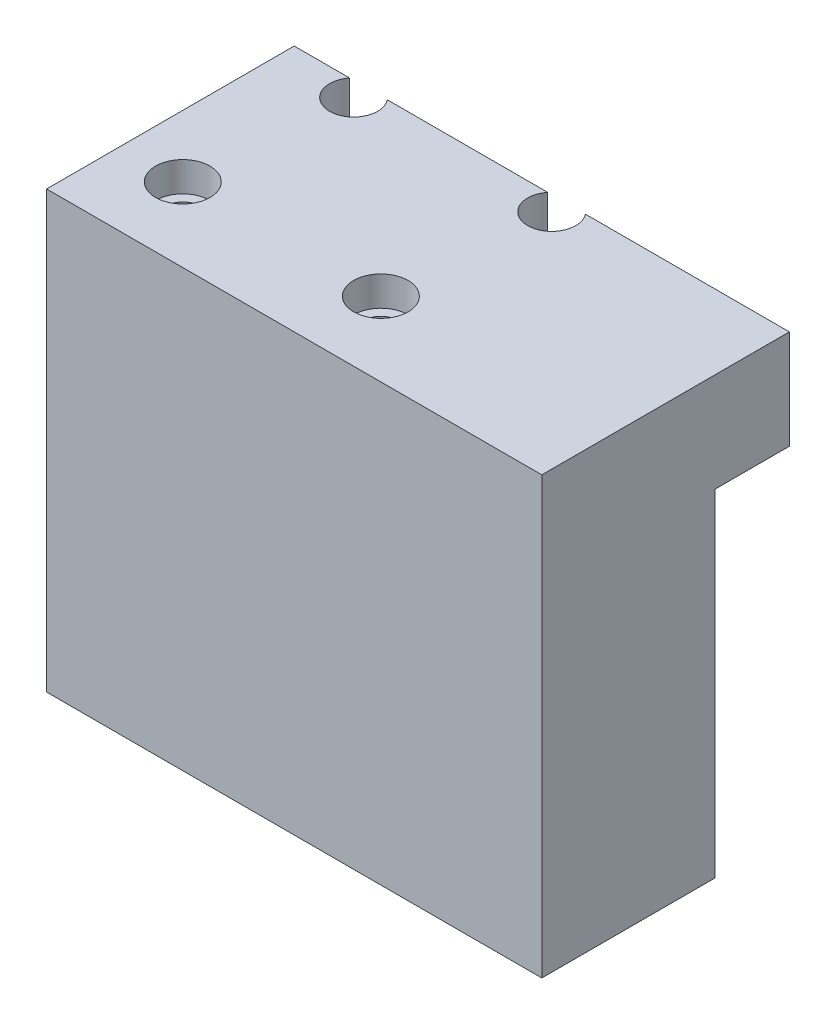
ISO-10303-21;
HEADER;
FILE_DESCRIPTION(('STEP AP214'),'2;1');
FILE_NAME('part.step','',(''),(''),'','','');
FILE_SCHEMA(('AUTOMOTIVE_DESIGN { 1 0 10303 214 1 1 1 1 }'));
ENDSEC;
DATA;
#1=APPLICATION_CONTEXT('core data for automotive mechanical design processes');
#2=APPLICATION_PROTOCOL_DEFINITION('international standard','automotive_design',2000,#1);
#3=PRODUCT_CONTEXT('',#1,'mechanical');
#4=PRODUCT('Part','Part','',(#3));
#5=PRODUCT_RELATED_PRODUCT_CATEGORY('part','',(#4));
#6=PRODUCT_DEFINITION_FORMATION('','',#4);
#7=PRODUCT_DEFINITION_CONTEXT('part definition',#1,'design');
#8=PRODUCT_DEFINITION('design','',#6,#7);
#9=PRODUCT_DEFINITION_SHAPE('','',#8);
#10=(LENGTH_UNIT() NAMED_UNIT(*) SI_UNIT(.MILLI.,.METRE.));
#11=(NAMED_UNIT(*) PLANE_ANGLE_UNIT() SI_UNIT($,.RADIAN.));
#12=(NAMED_UNIT(*) SI_UNIT($,.STERADIAN.) SOLID_ANGLE_UNIT());
#13=UNCERTAINTY_MEASURE_WITH_UNIT(LENGTH_MEASURE(1.E-05),#10,'distance_accuracy_value','');
#14=(GEOMETRIC_REPRESENTATION_CONTEXT(3) GLOBAL_UNCERTAINTY_ASSIGNED_CONTEXT((#13)) GLOBAL_UNIT_ASSIGNED_CONTEXT((#10,
#11,#12)) REPRESENTATION_CONTEXT('',''));
#15=CARTESIAN_POINT('',(0.,0.,0.));
#16=DIRECTION('',(0.,0.,1.));
#17=DIRECTION('',(1.,0.,0.));
#18=AXIS2_PLACEMENT_3D('',#15,#16,#17);
#19=CARTESIAN_POINT('',(0.,88.,0.));
#20=DIRECTION('',(0.,0.,-1.));
#21=DIRECTION('',(-1.,0.,0.));
#22=AXIS2_PLACEMENT_3D('',#19,#20,#21);
#23=PLANE('',#22);
#24=DIRECTION('',(0.,1.,0.));
#25=VECTOR('',#24,1.);
#26=CARTESIAN_POINT('',(51.1891601975418,0.,0.));
#27=LINE('',#26,#25);
#28=CARTESIAN_POINT('',(51.1891601975418,68.,0.));
#29=VERTEX_POINT('',#28);
#30=CARTESIAN_POINT('',(51.1891601975418,88.,0.));
#31=VERTEX_POINT('',#30);
#32=EDGE_CURVE('E113',#29,#31,#27,.T.);
#33=ORIENTED_EDGE('',*,*,#32,.F.);
#34=DIRECTION('',(-1.,0.,0.));
#35=VECTOR('',#34,1.);
#36=CARTESIAN_POINT('',(100.,68.,0.));
#37=LINE('',#36,#35);
#38=CARTESIAN_POINT('',(18.8108398024582,68.,0.));
#39=VERTEX_POINT('',#38);
#40=EDGE_CURVE('E57',#29,#39,#37,.T.);
#41=ORIENTED_EDGE('',*,*,#40,.T.);
#42=DIRECTION('',(0.,1.,0.));
#43=VECTOR('',#42,1.);
#44=CARTESIAN_POINT('',(18.8108398024582,0.,0.));
#45=LINE('',#44,#43);
#46=CARTESIAN_POINT('',(18.8108398024582,88.,0.));
#47=VERTEX_POINT('',#46);
#48=EDGE_CURVE('E177',#47,#39,#45,.F.);
#49=ORIENTED_EDGE('',*,*,#48,.F.);
#50=DIRECTION('',(-1.,0.,0.));
#51=VECTOR('',#50,1.);
#52=CARTESIAN_POINT('',(0.,88.,0.));
#53=LINE('',#52,#51);
#54=EDGE_CURVE('E133',#31,#47,#53,.T.);
#55=ORIENTED_EDGE('',*,*,#54,.F.);
#56=EDGE_LOOP('',(#33,#41,#49,#55));
#57=FACE_BOUND('',#56,.T.);
#58=ADVANCED_FACE('F35',(#57),#23,.T.);
#59=DIRECTION('',(0.,1.,0.));
#60=VECTOR('',#59,1.);
#61=CARTESIAN_POINT('',(11.1891601975418,0.,0.));
#62=LINE('',#61,#60);
#63=CARTESIAN_POINT('',(11.1891601975418,68.,0.));
#64=VERTEX_POINT('',#63);
#65=CARTESIAN_POINT('',(11.1891601975418,88.,0.));
#66=VERTEX_POINT('',#65);
#67=EDGE_CURVE('E172',#64,#66,#62,.T.);
#68=ORIENTED_EDGE('',*,*,#67,.F.);
#69=CARTESIAN_POINT('',(0.,68.,0.));
#70=VERTEX_POINT('',#69);
#71=EDGE_CURVE('E163',#64,#70,#37,.T.);
#72=ORIENTED_EDGE('',*,*,#71,.T.);
#73=DIRECTION('',(0.,-1.,0.));
#74=VECTOR('',#73,1.);
#75=CARTESIAN_POINT('',(0.,0.,0.));
#76=LINE('',#75,#74);
#77=CARTESIAN_POINT('',(0.,88.,0.));
#78=VERTEX_POINT('',#77);
#79=EDGE_CURVE('E146',#78,#70,#76,.T.);
#80=ORIENTED_EDGE('',*,*,#79,.F.);
#81=EDGE_CURVE('E135',#66,#78,#53,.T.);
#82=ORIENTED_EDGE('',*,*,#81,.F.);
#83=EDGE_LOOP('',(#68,#72,#80,#82));
#84=FACE_BOUND('',#83,.T.);
#85=ADVANCED_FACE('F234',(#84),#23,.T.);
#86=CARTESIAN_POINT('',(0.,0.,50.));
#87=DIRECTION('',(1.,0.,0.));
#88=DIRECTION('',(0.,0.,-1.));
#89=AXIS2_PLACEMENT_3D('',#86,#87,#88);
#90=PLANE('',#89);
#91=ORIENTED_EDGE('',*,*,#79,.T.);
#92=DIRECTION('',(0.,0.,-1.));
#93=VECTOR('',#92,1.);
#94=CARTESIAN_POINT('',(0.,68.,0.));
#95=LINE('',#94,#93);
#96=CARTESIAN_POINT('',(0.,68.,15.));
#97=VERTEX_POINT('',#96);
#98=EDGE_CURVE('E165',#97,#70,#95,.T.);
#99=ORIENTED_EDGE('',*,*,#98,.F.);
#100=DIRECTION('',(0.,1.,0.));
#101=VECTOR('',#100,1.);
#102=CARTESIAN_POINT('',(0.,0.,15.));
#103=LINE('',#102,#101);
#104=CARTESIAN_POINT('',(0.,0.,15.));
#105=VERTEX_POINT('',#104);
#106=EDGE_CURVE('E169',#105,#97,#103,.T.);
#107=ORIENTED_EDGE('',*,*,#106,.F.);
#108=DIRECTION('',(0.,0.,-1.));
#109=VECTOR('',#108,1.);
#110=CARTESIAN_POINT('',(0.,0.,50.));
#111=LINE('',#110,#109);
#112=CARTESIAN_POINT('',(0.,0.,50.));
#113=VERTEX_POINT('',#112);
#114=EDGE_CURVE('E279',#113,#105,#111,.T.);
#115=ORIENTED_EDGE('',*,*,#114,.F.);
#116=DIRECTION('',(0.,-1.,0.));
#117=VECTOR('',#116,1.);
#118=CARTESIAN_POINT('',(0.,0.,50.));
#119=LINE('',#118,#117);
#120=CARTESIAN_POINT('',(0.,88.,50.));
#121=VERTEX_POINT('',#120);
#122=EDGE_CURVE('E132',#121,#113,#119,.T.);
#123=ORIENTED_EDGE('',*,*,#122,.F.);
#124=DIRECTION('',(0.,0.,-1.));
#125=VECTOR('',#124,1.);
#126=CARTESIAN_POINT('',(0.,88.,50.));
#127=LINE('',#126,#125);
#128=EDGE_CURVE('E154',#121,#78,#127,.T.);
#129=ORIENTED_EDGE('',*,*,#128,.T.);
#130=EDGE_LOOP('',(#91,#99,#107,#115,#123,#129));
#131=FACE_BOUND('',#130,.T.);
#132=ADVANCED_FACE('F37',(#131),#90,.F.);
#133=CARTESIAN_POINT('',(0.,0.,50.));
#134=DIRECTION('',(0.,1.,0.));
#135=DIRECTION('',(0.,0.,1.));
#136=AXIS2_PLACEMENT_3D('',#133,#134,#135);
#137=PLANE('',#136);
#138=CARTESIAN_POINT('',(12.5,0.,35.));
#139=DIRECTION('',(0.,1.,0.));
#140=DIRECTION('',(0.,0.,1.));
#141=AXIS2_PLACEMENT_3D('',#138,#139,#140);
#142=CIRCLE('',#141,3.49999999999998);
#143=CARTESIAN_POINT('',(12.5,0.,38.5));
#144=VERTEX_POINT('',#143);
#145=EDGE_CURVE('E194',#144,#144,#142,.T.);
#146=ORIENTED_EDGE('',*,*,#145,.T.);
#147=EDGE_LOOP('',(#146));
#148=FACE_BOUND('',#147,.T.);
#149=CARTESIAN_POINT('',(52.5,0.,35.));
#150=DIRECTION('',(0.,1.,0.));
#151=DIRECTION('',(0.,0.,1.));
#152=AXIS2_PLACEMENT_3D('',#149,#150,#151);
#153=CIRCLE('',#152,3.49999999999998);
#154=CARTESIAN_POINT('',(52.5,0.,38.5));
#155=VERTEX_POINT('',#154);
#156=EDGE_CURVE('E117',#155,#155,#153,.T.);
#157=ORIENTED_EDGE('',*,*,#156,.T.);
#158=EDGE_LOOP('',(#157));
#159=FACE_BOUND('',#158,.T.);
#160=ORIENTED_EDGE('',*,*,#114,.T.);
#161=DIRECTION('',(-1.,0.,0.));
#162=VECTOR('',#161,1.);
#163=CARTESIAN_POINT('',(100.,0.,15.));
#164=LINE('',#163,#162);
#165=CARTESIAN_POINT('',(100.,0.,15.));
#166=VERTEX_POINT('',#165);
#167=EDGE_CURVE('E158',#166,#105,#164,.T.);
#168=ORIENTED_EDGE('',*,*,#167,.F.);
#169=DIRECTION('',(0.,0.,-1.));
#170=VECTOR('',#169,1.);
#171=CARTESIAN_POINT('',(100.,0.,50.));
#172=LINE('',#171,#170);
#173=CARTESIAN_POINT('',(100.,0.,50.));
#174=VERTEX_POINT('',#173);
#175=EDGE_CURVE('E285',#174,#166,#172,.T.);
#176=ORIENTED_EDGE('',*,*,#175,.F.);
#177=DIRECTION('',(1.,0.,0.));
#178=VECTOR('',#177,1.);
#179=CARTESIAN_POINT('',(0.,0.,50.));
#180=LINE('',#179,#178);
#181=EDGE_CURVE('E137',#113,#174,#180,.T.);
#182=ORIENTED_EDGE('',*,*,#181,.F.);
#183=EDGE_LOOP('',(#160,#168,#176,#182));
#184=FACE_BOUND('',#183,.T.);
#185=ADVANCED_FACE('F272',(#148,#159,#184),#137,.F.);
#186=CARTESIAN_POINT('',(100.,0.,50.));
#187=DIRECTION('',(-1.,0.,0.));
#188=DIRECTION('',(0.,0.,1.));
#189=AXIS2_PLACEMENT_3D('',#186,#187,#188);
#190=PLANE('',#189);
#191=DIRECTION('',(0.,1.,0.));
#192=VECTOR('',#191,1.);
#193=CARTESIAN_POINT('',(100.,0.,15.));
#194=LINE('',#193,#192);
#195=CARTESIAN_POINT('',(100.,68.,15.));
#196=VERTEX_POINT('',#195);
#197=EDGE_CURVE('E168',#166,#196,#194,.T.);
#198=ORIENTED_EDGE('',*,*,#197,.T.);
#199=DIRECTION('',(0.,0.,-1.));
#200=VECTOR('',#199,1.);
#201=CARTESIAN_POINT('',(100.,68.,0.));
#202=LINE('',#201,#200);
#203=CARTESIAN_POINT('',(100.,68.,0.));
#204=VERTEX_POINT('',#203);
#205=EDGE_CURVE('E161',#196,#204,#202,.T.);
#206=ORIENTED_EDGE('',*,*,#205,.T.);
#207=DIRECTION('',(0.,1.,0.));
#208=VECTOR('',#207,1.);
#209=CARTESIAN_POINT('',(100.,0.,0.));
#210=LINE('',#209,#208);
#211=CARTESIAN_POINT('',(100.,88.,0.));
#212=VERTEX_POINT('',#211);
#213=EDGE_CURVE('E141',#204,#212,#210,.T.);
#214=ORIENTED_EDGE('',*,*,#213,.T.);
#215=DIRECTION('',(0.,0.,-1.));
#216=VECTOR('',#215,1.);
#217=CARTESIAN_POINT('',(100.,88.,50.));
#218=LINE('',#217,#216);
#219=CARTESIAN_POINT('',(100.,88.,50.));
#220=VERTEX_POINT('',#219);
#221=EDGE_CURVE('E131',#220,#212,#218,.T.);
#222=ORIENTED_EDGE('',*,*,#221,.F.);
#223=DIRECTION('',(0.,1.,0.));
#224=VECTOR('',#223,1.);
#225=CARTESIAN_POINT('',(100.,0.,50.));
#226=LINE('',#225,#224);
#227=EDGE_CURVE('E155',#174,#220,#226,.T.);
#228=ORIENTED_EDGE('',*,*,#227,.F.);
#229=ORIENTED_EDGE('',*,*,#175,.T.);
#230=EDGE_LOOP('',(#198,#206,#214,#222,#228,#229));
#231=FACE_BOUND('',#230,.T.);
#232=ADVANCED_FACE('F212',(#231),#190,.F.);
#233=CARTESIAN_POINT('',(0.,88.,50.));
#234=DIRECTION('',(0.,-1.,0.));
#235=DIRECTION('',(0.,0.,-1.));
#236=AXIS2_PLACEMENT_3D('',#233,#234,#235);
#237=PLANE('',#236);
#238=CARTESIAN_POINT('',(12.5,88.,35.));
#239=DIRECTION('',(0.,1.,0.));
#240=DIRECTION('',(0.,0.,1.));
#241=AXIS2_PLACEMENT_3D('',#238,#239,#240);
#242=CIRCLE('',#241,5.5);
#243=CARTESIAN_POINT('',(12.5,88.,40.5));
#244=VERTEX_POINT('',#243);
#245=EDGE_CURVE('E203',#244,#244,#242,.T.);
#246=ORIENTED_EDGE('',*,*,#245,.F.);
#247=EDGE_LOOP('',(#246));
#248=FACE_BOUND('',#247,.T.);
#249=CARTESIAN_POINT('',(52.5,88.,35.));
#250=DIRECTION('',(0.,1.,0.));
#251=DIRECTION('',(0.,0.,1.));
#252=AXIS2_PLACEMENT_3D('',#249,#250,#251);
#253=CIRCLE('',#252,5.5);
#254=CARTESIAN_POINT('',(52.5,88.,40.5));
#255=VERTEX_POINT('',#254);
#256=EDGE_CURVE('E191',#255,#255,#253,.T.);
#257=ORIENTED_EDGE('',*,*,#256,.F.);
#258=EDGE_LOOP('',(#257));
#259=FACE_BOUND('',#258,.T.);
#260=CARTESIAN_POINT('',(58.8108398024582,88.,0.));
#261=VERTEX_POINT('',#260);
#262=EDGE_CURVE('E124',#212,#261,#53,.T.);
#263=ORIENTED_EDGE('',*,*,#262,.T.);
#264=CARTESIAN_POINT('',(55.,88.,3.));
#265=DIRECTION('',(0.,1.,0.));
#266=DIRECTION('',(0.,0.,1.));
#267=AXIS2_PLACEMENT_3D('',#264,#265,#266);
#268=CIRCLE('',#267,4.85);
#269=EDGE_CURVE('E111',#31,#261,#268,.T.);
#270=ORIENTED_EDGE('',*,*,#269,.F.);
#271=ORIENTED_EDGE('',*,*,#54,.T.);
#272=CARTESIAN_POINT('',(15.,88.,3.));
#273=DIRECTION('',(0.,1.,0.));
#274=DIRECTION('',(0.,0.,1.));
#275=AXIS2_PLACEMENT_3D('',#272,#273,#274);
#276=CIRCLE('',#275,4.85);
#277=EDGE_CURVE('E179',#66,#47,#276,.T.);
#278=ORIENTED_EDGE('',*,*,#277,.F.);
#279=ORIENTED_EDGE('',*,*,#81,.T.);
#280=ORIENTED_EDGE('',*,*,#128,.F.);
#281=DIRECTION('',(-1.,0.,0.));
#282=VECTOR('',#281,1.);
#283=CARTESIAN_POINT('',(0.,88.,50.));
#284=LINE('',#283,#282);
#285=EDGE_CURVE('E152',#220,#121,#284,.T.);
#286=ORIENTED_EDGE('',*,*,#285,.F.);
#287=ORIENTED_EDGE('',*,*,#221,.T.);
#288=EDGE_LOOP('',(#263,#270,#271,#278,#279,#280,#286,#287));
#289=FACE_BOUND('',#288,.T.);
#290=ADVANCED_FACE('F128',(#248,#259,#289),#237,.F.);
#291=CARTESIAN_POINT('',(0.,88.,50.));
#292=DIRECTION('',(0.,0.,-1.));
#293=DIRECTION('',(-1.,0.,0.));
#294=AXIS2_PLACEMENT_3D('',#291,#292,#293);
#295=PLANE('',#294);
#296=ORIENTED_EDGE('',*,*,#122,.T.);
#297=ORIENTED_EDGE('',*,*,#181,.T.);
#298=ORIENTED_EDGE('',*,*,#227,.T.);
#299=ORIENTED_EDGE('',*,*,#285,.T.);
#300=EDGE_LOOP('',(#296,#297,#298,#299));
#301=FACE_BOUND('',#300,.T.);
#302=ADVANCED_FACE('F211',(#301),#295,.F.);
#303=DIRECTION('',(0.,1.,0.));
#304=VECTOR('',#303,1.);
#305=CARTESIAN_POINT('',(58.8108398024582,0.,0.));
#306=LINE('',#305,#304);
#307=CARTESIAN_POINT('',(58.8108398024582,68.,0.));
#308=VERTEX_POINT('',#307);
#309=EDGE_CURVE('E50',#261,#308,#306,.F.);
#310=ORIENTED_EDGE('',*,*,#309,.F.);
#311=ORIENTED_EDGE('',*,*,#262,.F.);
#312=ORIENTED_EDGE('',*,*,#213,.F.);
#313=EDGE_CURVE('E125',#204,#308,#37,.T.);
#314=ORIENTED_EDGE('',*,*,#313,.T.);
#315=EDGE_LOOP('',(#310,#311,#312,#314));
#316=FACE_BOUND('',#315,.T.);
#317=ADVANCED_FACE('F122',(#316),#23,.T.);
#318=CARTESIAN_POINT('',(100.,68.,0.));
#319=DIRECTION('',(0.,1.,0.));
#320=DIRECTION('',(0.,0.,1.));
#321=AXIS2_PLACEMENT_3D('',#318,#319,#320);
#322=PLANE('',#321);
#323=ORIENTED_EDGE('',*,*,#40,.F.);
#324=CARTESIAN_POINT('',(55.,68.,3.));
#325=DIRECTION('',(0.,1.,0.));
#326=DIRECTION('',(0.,0.,1.));
#327=AXIS2_PLACEMENT_3D('',#324,#325,#326);
#328=CIRCLE('',#327,4.85);
#329=EDGE_CURVE('E11',#29,#308,#328,.T.);
#330=ORIENTED_EDGE('',*,*,#329,.T.);
#331=ORIENTED_EDGE('',*,*,#313,.F.);
#332=ORIENTED_EDGE('',*,*,#205,.F.);
#333=DIRECTION('',(-1.,0.,0.));
#334=VECTOR('',#333,1.);
#335=CARTESIAN_POINT('',(100.,68.,15.));
#336=LINE('',#335,#334);
#337=EDGE_CURVE('E160',#196,#97,#336,.T.);
#338=ORIENTED_EDGE('',*,*,#337,.T.);
#339=ORIENTED_EDGE('',*,*,#98,.T.);
#340=ORIENTED_EDGE('',*,*,#71,.F.);
#341=CARTESIAN_POINT('',(15.,68.,3.));
#342=DIRECTION('',(0.,1.,0.));
#343=DIRECTION('',(0.,0.,1.));
#344=AXIS2_PLACEMENT_3D('',#341,#342,#343);
#345=CIRCLE('',#344,4.85);
#346=EDGE_CURVE('E43',#64,#39,#345,.T.);
#347=ORIENTED_EDGE('',*,*,#346,.T.);
#348=EDGE_LOOP('',(#323,#330,#331,#332,#338,#339,#340,#347));
#349=FACE_BOUND('',#348,.T.);
#350=ADVANCED_FACE('F242',(#349),#322,.F.);
#351=CARTESIAN_POINT('',(100.,0.,15.));
#352=DIRECTION('',(0.,0.,1.));
#353=DIRECTION('',(1.,0.,0.));
#354=AXIS2_PLACEMENT_3D('',#351,#352,#353);
#355=PLANE('',#354);
#356=ORIENTED_EDGE('',*,*,#106,.T.);
#357=ORIENTED_EDGE('',*,*,#337,.F.);
#358=ORIENTED_EDGE('',*,*,#197,.F.);
#359=ORIENTED_EDGE('',*,*,#167,.T.);
#360=EDGE_LOOP('',(#356,#357,#358,#359));
#361=FACE_BOUND('',#360,.T.);
#362=ADVANCED_FACE('F247',(#361),#355,.F.);
#363=CARTESIAN_POINT('',(15.,0.,3.));
#364=DIRECTION('',(0.,1.,0.));
#365=DIRECTION('',(0.,0.,1.));
#366=AXIS2_PLACEMENT_3D('',#363,#364,#365);
#367=CYLINDRICAL_SURFACE('',#366,4.85);
#368=ORIENTED_EDGE('',*,*,#67,.T.);
#369=ORIENTED_EDGE('',*,*,#277,.T.);
#370=ORIENTED_EDGE('',*,*,#48,.T.);
#371=ORIENTED_EDGE('',*,*,#346,.F.);
#372=EDGE_LOOP('',(#368,#369,#370,#371));
#373=FACE_BOUND('',#372,.T.);
#374=ADVANCED_FACE('F255',(#373),#367,.F.);
#375=CARTESIAN_POINT('',(55.,0.,3.));
#376=DIRECTION('',(0.,1.,0.));
#377=DIRECTION('',(0.,0.,1.));
#378=AXIS2_PLACEMENT_3D('',#375,#376,#377);
#379=CYLINDRICAL_SURFACE('',#378,4.85);
#380=ORIENTED_EDGE('',*,*,#32,.T.);
#381=ORIENTED_EDGE('',*,*,#269,.T.);
#382=ORIENTED_EDGE('',*,*,#309,.T.);
#383=ORIENTED_EDGE('',*,*,#329,.F.);
#384=EDGE_LOOP('',(#380,#381,#382,#383));
#385=FACE_BOUND('',#384,.T.);
#386=ADVANCED_FACE('F112',(#385),#379,.F.);
#387=CARTESIAN_POINT('',(52.5,88.,35.));
#388=DIRECTION('',(0.,1.,0.));
#389=DIRECTION('',(0.,0.,1.));
#390=AXIS2_PLACEMENT_3D('',#387,#388,#389);
#391=CYLINDRICAL_SURFACE('',#390,3.5);
#392=ORIENTED_EDGE('',*,*,#156,.F.);
#393=EDGE_LOOP('',(#392));
#394=FACE_BOUND('',#393,.T.);
#395=CARTESIAN_POINT('',(52.5,82.,35.));
#396=DIRECTION('',(0.,1.,0.));
#397=DIRECTION('',(0.,0.,1.));
#398=AXIS2_PLACEMENT_3D('',#395,#396,#397);
#399=CIRCLE('',#398,3.50000000000001);
#400=CARTESIAN_POINT('',(52.5,82.,38.5));
#401=VERTEX_POINT('',#400);
#402=EDGE_CURVE('E185',#401,#401,#399,.T.);
#403=ORIENTED_EDGE('',*,*,#402,.T.);
#404=EDGE_LOOP('',(#403));
#405=FACE_BOUND('',#404,.T.);
#406=ADVANCED_FACE('F229',(#394,#405),#391,.F.);
#407=CARTESIAN_POINT('',(56.,82.,35.));
#408=DIRECTION('',(0.,-1.,0.));
#409=DIRECTION('',(0.,0.,-1.));
#410=AXIS2_PLACEMENT_3D('',#407,#408,#409);
#411=PLANE('',#410);
#412=ORIENTED_EDGE('',*,*,#402,.F.);
#413=EDGE_LOOP('',(#412));
#414=FACE_BOUND('',#413,.T.);
#415=CARTESIAN_POINT('',(52.5,82.,35.));
#416=DIRECTION('',(0.,1.,0.));
#417=DIRECTION('',(0.,0.,1.));
#418=AXIS2_PLACEMENT_3D('',#415,#416,#417);
#419=CIRCLE('',#418,5.5);
#420=CARTESIAN_POINT('',(52.5,82.,40.5));
#421=VERTEX_POINT('',#420);
#422=EDGE_CURVE('E188',#421,#421,#419,.T.);
#423=ORIENTED_EDGE('',*,*,#422,.T.);
#424=EDGE_LOOP('',(#423));
#425=FACE_BOUND('',#424,.T.);
#426=ADVANCED_FACE('F219',(#414,#425),#411,.F.);
#427=CARTESIAN_POINT('',(52.5,88.,35.));
#428=DIRECTION('',(0.,1.,0.));
#429=DIRECTION('',(0.,0.,1.));
#430=AXIS2_PLACEMENT_3D('',#427,#428,#429);
#431=CYLINDRICAL_SURFACE('',#430,5.5);
#432=ORIENTED_EDGE('',*,*,#422,.F.);
#433=EDGE_LOOP('',(#432));
#434=FACE_BOUND('',#433,.T.);
#435=ORIENTED_EDGE('',*,*,#256,.T.);
#436=EDGE_LOOP('',(#435));
#437=FACE_BOUND('',#436,.T.);
#438=ADVANCED_FACE('F216',(#434,#437),#431,.F.);
#439=CARTESIAN_POINT('',(12.5,88.,35.));
#440=DIRECTION('',(0.,1.,0.));
#441=DIRECTION('',(0.,0.,1.));
#442=AXIS2_PLACEMENT_3D('',#439,#440,#441);
#443=CYLINDRICAL_SURFACE('',#442,3.49999999999999);
#444=ORIENTED_EDGE('',*,*,#145,.F.);
#445=EDGE_LOOP('',(#444));
#446=FACE_BOUND('',#445,.T.);
#447=CARTESIAN_POINT('',(12.5,82.,35.));
#448=DIRECTION('',(0.,1.,0.));
#449=DIRECTION('',(0.,0.,1.));
#450=AXIS2_PLACEMENT_3D('',#447,#448,#449);
#451=CIRCLE('',#450,3.50000000000001);
#452=CARTESIAN_POINT('',(12.5,82.,38.5));
#453=VERTEX_POINT('',#452);
#454=EDGE_CURVE('E197',#453,#453,#451,.T.);
#455=ORIENTED_EDGE('',*,*,#454,.T.);
#456=EDGE_LOOP('',(#455));
#457=FACE_BOUND('',#456,.T.);
#458=ADVANCED_FACE('F218',(#446,#457),#443,.F.);
#459=CARTESIAN_POINT('',(16.,82.,35.));
#460=DIRECTION('',(0.,-1.,0.));
#461=DIRECTION('',(0.,0.,-1.));
#462=AXIS2_PLACEMENT_3D('',#459,#460,#461);
#463=PLANE('',#462);
#464=ORIENTED_EDGE('',*,*,#454,.F.);
#465=EDGE_LOOP('',(#464));
#466=FACE_BOUND('',#465,.T.);
#467=CARTESIAN_POINT('',(12.5,82.,35.));
#468=DIRECTION('',(0.,1.,0.));
#469=DIRECTION('',(0.,0.,1.));
#470=AXIS2_PLACEMENT_3D('',#467,#468,#469);
#471=CIRCLE('',#470,5.5);
#472=CARTESIAN_POINT('',(12.5,82.,40.5));
#473=VERTEX_POINT('',#472);
#474=EDGE_CURVE('E200',#473,#473,#471,.T.);
#475=ORIENTED_EDGE('',*,*,#474,.T.);
#476=EDGE_LOOP('',(#475));
#477=FACE_BOUND('',#476,.T.);
#478=ADVANCED_FACE('F226',(#466,#477),#463,.F.);
#479=CARTESIAN_POINT('',(12.5,88.,35.));
#480=DIRECTION('',(0.,1.,0.));
#481=DIRECTION('',(0.,0.,1.));
#482=AXIS2_PLACEMENT_3D('',#479,#480,#481);
#483=CYLINDRICAL_SURFACE('',#482,5.5);
#484=ORIENTED_EDGE('',*,*,#474,.F.);
#485=EDGE_LOOP('',(#484));
#486=FACE_BOUND('',#485,.T.);
#487=ORIENTED_EDGE('',*,*,#245,.T.);
#488=EDGE_LOOP('',(#487));
#489=FACE_BOUND('',#488,.T.);
#490=ADVANCED_FACE('F207',(#486,#489),#483,.F.);
#491=CLOSED_SHELL('',(#58,#85,#132,#185,#232,#290,#302,#317,#350,#362,#374,#386,#406,#426,#438,
#458,#478,#490));
#492=MANIFOLD_SOLID_BREP('B2',#491);
#493=ADVANCED_BREP_SHAPE_REPRESENTATION('',(#18,#492),#14);
#494=SHAPE_DEFINITION_REPRESENTATION(#9,#493);
ENDSEC;
END-ISO-10303-21;
